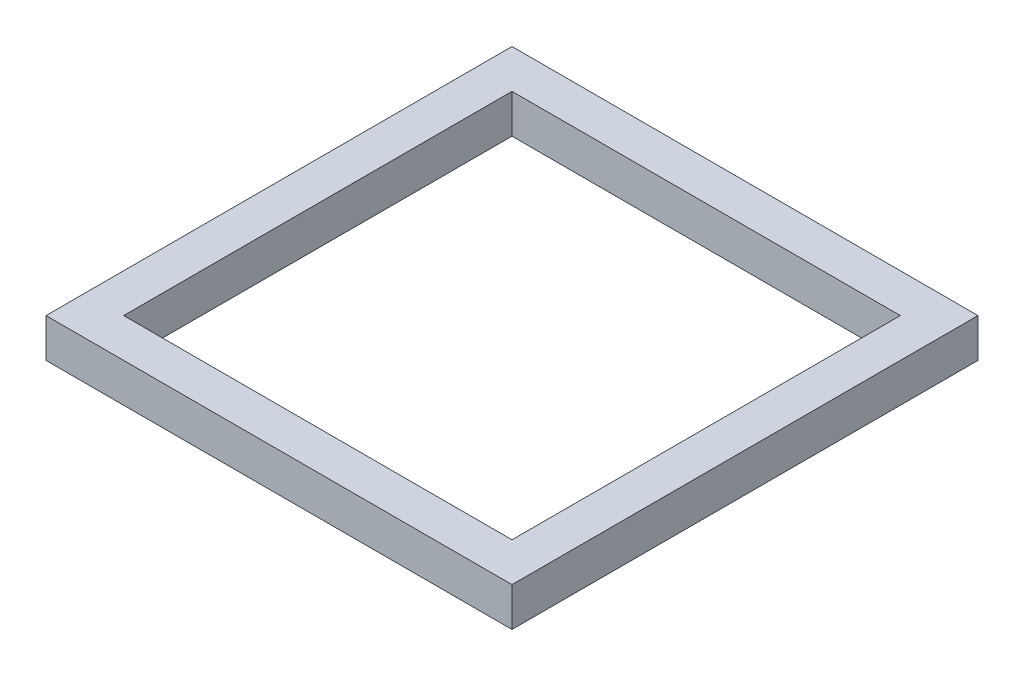
ISO-10303-21;
HEADER;
FILE_DESCRIPTION(('STEP AP214'),'2;1');
FILE_NAME('part.step','',(''),(''),'','','');
FILE_SCHEMA(('AUTOMOTIVE_DESIGN { 1 0 10303 214 1 1 1 1 }'));
ENDSEC;
DATA;
#1=APPLICATION_CONTEXT('core data for automotive mechanical design processes');
#2=APPLICATION_PROTOCOL_DEFINITION('international standard','automotive_design',2000,#1);
#3=PRODUCT_CONTEXT('',#1,'mechanical');
#4=PRODUCT('Part','Part','',(#3));
#5=PRODUCT_RELATED_PRODUCT_CATEGORY('part','',(#4));
#6=PRODUCT_DEFINITION_FORMATION('','',#4);
#7=PRODUCT_DEFINITION_CONTEXT('part definition',#1,'design');
#8=PRODUCT_DEFINITION('design','',#6,#7);
#9=PRODUCT_DEFINITION_SHAPE('','',#8);
#10=(LENGTH_UNIT() NAMED_UNIT(*) SI_UNIT(.MILLI.,.METRE.));
#11=(NAMED_UNIT(*) PLANE_ANGLE_UNIT() SI_UNIT($,.RADIAN.));
#12=(NAMED_UNIT(*) SI_UNIT($,.STERADIAN.) SOLID_ANGLE_UNIT());
#13=UNCERTAINTY_MEASURE_WITH_UNIT(LENGTH_MEASURE(1.E-05),#10,'distance_accuracy_value','');
#14=(GEOMETRIC_REPRESENTATION_CONTEXT(3) GLOBAL_UNCERTAINTY_ASSIGNED_CONTEXT((#13)) GLOBAL_UNIT_ASSIGNED_CONTEXT((#10,
#11,#12)) REPRESENTATION_CONTEXT('',''));
#15=CARTESIAN_POINT('',(0.,0.,0.));
#16=DIRECTION('',(0.,0.,1.));
#17=DIRECTION('',(1.,0.,0.));
#18=AXIS2_PLACEMENT_3D('',#15,#16,#17);
#19=CARTESIAN_POINT('',(0.,5.,0.));
#20=DIRECTION('',(0.,-1.,0.));
#21=DIRECTION('',(0.,0.,-1.));
#22=AXIS2_PLACEMENT_3D('',#19,#20,#21);
#23=PLANE('',#22);
#24=DIRECTION('',(0.,0.,-1.));
#25=VECTOR('',#24,1.);
#26=CARTESIAN_POINT('',(30.,5.,30.));
#27=LINE('',#26,#25);
#28=CARTESIAN_POINT('',(30.,5.,30.));
#29=VERTEX_POINT('',#28);
#30=CARTESIAN_POINT('',(30.,5.,-30.));
#31=VERTEX_POINT('',#30);
#32=EDGE_CURVE('E161',#29,#31,#27,.T.);
#33=ORIENTED_EDGE('',*,*,#32,.T.);
#34=DIRECTION('',(-1.,0.,0.));
#35=VECTOR('',#34,1.);
#36=CARTESIAN_POINT('',(-30.,5.,-30.));
#37=LINE('',#36,#35);
#38=CARTESIAN_POINT('',(-30.,5.,-30.));
#39=VERTEX_POINT('',#38);
#40=EDGE_CURVE('E170',#31,#39,#37,.T.);
#41=ORIENTED_EDGE('',*,*,#40,.T.);
#42=DIRECTION('',(0.,0.,1.));
#43=VECTOR('',#42,1.);
#44=CARTESIAN_POINT('',(-30.,5.,30.));
#45=LINE('',#44,#43);
#46=CARTESIAN_POINT('',(-30.,5.,30.));
#47=VERTEX_POINT('',#46);
#48=EDGE_CURVE('E171',#39,#47,#45,.T.);
#49=ORIENTED_EDGE('',*,*,#48,.T.);
#50=DIRECTION('',(1.,0.,0.));
#51=VECTOR('',#50,1.);
#52=CARTESIAN_POINT('',(-30.,5.,30.));
#53=LINE('',#52,#51);
#54=EDGE_CURVE('E176',#47,#29,#53,.T.);
#55=ORIENTED_EDGE('',*,*,#54,.T.);
#56=EDGE_LOOP('',(#33,#41,#49,#55));
#57=FACE_BOUND('',#56,.T.);
#58=DIRECTION('',(0.,0.,1.));
#59=VECTOR('',#58,1.);
#60=CARTESIAN_POINT('',(-25.,5.,25.));
#61=LINE('',#60,#59);
#62=CARTESIAN_POINT('',(-25.,5.,-25.));
#63=VERTEX_POINT('',#62);
#64=CARTESIAN_POINT('',(-25.,5.,25.));
#65=VERTEX_POINT('',#64);
#66=EDGE_CURVE('E113',#63,#65,#61,.T.);
#67=ORIENTED_EDGE('',*,*,#66,.F.);
#68=DIRECTION('',(-1.,0.,0.));
#69=VECTOR('',#68,1.);
#70=CARTESIAN_POINT('',(-25.,5.,-25.));
#71=LINE('',#70,#69);
#72=CARTESIAN_POINT('',(25.,5.,-25.));
#73=VERTEX_POINT('',#72);
#74=EDGE_CURVE('E143',#73,#63,#71,.T.);
#75=ORIENTED_EDGE('',*,*,#74,.F.);
#76=DIRECTION('',(0.,0.,-1.));
#77=VECTOR('',#76,1.);
#78=CARTESIAN_POINT('',(25.,5.,25.));
#79=LINE('',#78,#77);
#80=CARTESIAN_POINT('',(25.,5.,25.));
#81=VERTEX_POINT('',#80);
#82=EDGE_CURVE('E140',#81,#73,#79,.T.);
#83=ORIENTED_EDGE('',*,*,#82,.F.);
#84=DIRECTION('',(1.,0.,0.));
#85=VECTOR('',#84,1.);
#86=CARTESIAN_POINT('',(-25.,5.,25.));
#87=LINE('',#86,#85);
#88=EDGE_CURVE('E125',#65,#81,#87,.T.);
#89=ORIENTED_EDGE('',*,*,#88,.F.);
#90=EDGE_LOOP('',(#67,#75,#83,#89));
#91=FACE_BOUND('',#90,.T.);
#92=ADVANCED_FACE('F47',(#57,#91),#23,.F.);
#93=CARTESIAN_POINT('',(0.,0.,0.));
#94=DIRECTION('',(0.,-1.,0.));
#95=DIRECTION('',(0.,0.,-1.));
#96=AXIS2_PLACEMENT_3D('',#93,#94,#95);
#97=PLANE('',#96);
#98=DIRECTION('',(0.,0.,-1.));
#99=VECTOR('',#98,1.);
#100=CARTESIAN_POINT('',(30.,0.,30.));
#101=LINE('',#100,#99);
#102=CARTESIAN_POINT('',(30.,0.,30.));
#103=VERTEX_POINT('',#102);
#104=CARTESIAN_POINT('',(30.,0.,-30.));
#105=VERTEX_POINT('',#104);
#106=EDGE_CURVE('E133',#103,#105,#101,.T.);
#107=ORIENTED_EDGE('',*,*,#106,.F.);
#108=DIRECTION('',(1.,0.,0.));
#109=VECTOR('',#108,1.);
#110=CARTESIAN_POINT('',(-30.,0.,30.));
#111=LINE('',#110,#109);
#112=CARTESIAN_POINT('',(-30.,0.,30.));
#113=VERTEX_POINT('',#112);
#114=EDGE_CURVE('E169',#113,#103,#111,.T.);
#115=ORIENTED_EDGE('',*,*,#114,.F.);
#116=DIRECTION('',(0.,0.,1.));
#117=VECTOR('',#116,1.);
#118=CARTESIAN_POINT('',(-30.,0.,30.));
#119=LINE('',#118,#117);
#120=CARTESIAN_POINT('',(-30.,0.,-30.));
#121=VERTEX_POINT('',#120);
#122=EDGE_CURVE('E186',#121,#113,#119,.T.);
#123=ORIENTED_EDGE('',*,*,#122,.F.);
#124=DIRECTION('',(-1.,0.,0.));
#125=VECTOR('',#124,1.);
#126=CARTESIAN_POINT('',(-30.,0.,-30.));
#127=LINE('',#126,#125);
#128=EDGE_CURVE('E183',#105,#121,#127,.T.);
#129=ORIENTED_EDGE('',*,*,#128,.F.);
#130=EDGE_LOOP('',(#107,#115,#123,#129));
#131=FACE_BOUND('',#130,.T.);
#132=DIRECTION('',(-1.,0.,0.));
#133=VECTOR('',#132,1.);
#134=CARTESIAN_POINT('',(-25.,0.,-25.));
#135=LINE('',#134,#133);
#136=CARTESIAN_POINT('',(25.,0.,-25.));
#137=VERTEX_POINT('',#136);
#138=CARTESIAN_POINT('',(-25.,0.,-25.));
#139=VERTEX_POINT('',#138);
#140=EDGE_CURVE('E124',#137,#139,#135,.T.);
#141=ORIENTED_EDGE('',*,*,#140,.T.);
#142=DIRECTION('',(0.,0.,1.));
#143=VECTOR('',#142,1.);
#144=CARTESIAN_POINT('',(-25.,0.,25.));
#145=LINE('',#144,#143);
#146=CARTESIAN_POINT('',(-25.,0.,25.));
#147=VERTEX_POINT('',#146);
#148=EDGE_CURVE('E73',#139,#147,#145,.T.);
#149=ORIENTED_EDGE('',*,*,#148,.T.);
#150=DIRECTION('',(1.,0.,0.));
#151=VECTOR('',#150,1.);
#152=CARTESIAN_POINT('',(-25.,0.,25.));
#153=LINE('',#152,#151);
#154=CARTESIAN_POINT('',(25.,0.,25.));
#155=VERTEX_POINT('',#154);
#156=EDGE_CURVE('E131',#147,#155,#153,.T.);
#157=ORIENTED_EDGE('',*,*,#156,.T.);
#158=DIRECTION('',(0.,0.,-1.));
#159=VECTOR('',#158,1.);
#160=CARTESIAN_POINT('',(25.,0.,25.));
#161=LINE('',#160,#159);
#162=EDGE_CURVE('E155',#155,#137,#161,.T.);
#163=ORIENTED_EDGE('',*,*,#162,.T.);
#164=EDGE_LOOP('',(#141,#149,#157,#163));
#165=FACE_BOUND('',#164,.T.);
#166=ADVANCED_FACE('F209',(#131,#165),#97,.T.);
#167=CARTESIAN_POINT('',(30.,5.,30.));
#168=DIRECTION('',(-1.,0.,0.));
#169=DIRECTION('',(0.,0.,1.));
#170=AXIS2_PLACEMENT_3D('',#167,#168,#169);
#171=PLANE('',#170);
#172=ORIENTED_EDGE('',*,*,#106,.T.);
#173=DIRECTION('',(0.,-1.,0.));
#174=VECTOR('',#173,1.);
#175=CARTESIAN_POINT('',(30.,5.,-30.));
#176=LINE('',#175,#174);
#177=EDGE_CURVE('E11',#31,#105,#176,.T.);
#178=ORIENTED_EDGE('',*,*,#177,.F.);
#179=ORIENTED_EDGE('',*,*,#32,.F.);
#180=DIRECTION('',(0.,-1.,0.));
#181=VECTOR('',#180,1.);
#182=CARTESIAN_POINT('',(30.,5.,30.));
#183=LINE('',#182,#181);
#184=EDGE_CURVE('E177',#29,#103,#183,.T.);
#185=ORIENTED_EDGE('',*,*,#184,.T.);
#186=EDGE_LOOP('',(#172,#178,#179,#185));
#187=FACE_BOUND('',#186,.T.);
#188=ADVANCED_FACE('F51',(#187),#171,.F.);
#189=CARTESIAN_POINT('',(-30.,5.,-30.));
#190=DIRECTION('',(0.,0.,1.));
#191=DIRECTION('',(1.,0.,0.));
#192=AXIS2_PLACEMENT_3D('',#189,#190,#191);
#193=PLANE('',#192);
#194=ORIENTED_EDGE('',*,*,#128,.T.);
#195=DIRECTION('',(0.,-1.,0.));
#196=VECTOR('',#195,1.);
#197=CARTESIAN_POINT('',(-30.,5.,-30.));
#198=LINE('',#197,#196);
#199=EDGE_CURVE('E59',#39,#121,#198,.T.);
#200=ORIENTED_EDGE('',*,*,#199,.F.);
#201=ORIENTED_EDGE('',*,*,#40,.F.);
#202=ORIENTED_EDGE('',*,*,#177,.T.);
#203=EDGE_LOOP('',(#194,#200,#201,#202));
#204=FACE_BOUND('',#203,.T.);
#205=ADVANCED_FACE('F219',(#204),#193,.F.);
#206=CARTESIAN_POINT('',(-30.,5.,30.));
#207=DIRECTION('',(1.,0.,0.));
#208=DIRECTION('',(0.,0.,-1.));
#209=AXIS2_PLACEMENT_3D('',#206,#207,#208);
#210=PLANE('',#209);
#211=ORIENTED_EDGE('',*,*,#122,.T.);
#212=DIRECTION('',(0.,-1.,0.));
#213=VECTOR('',#212,1.);
#214=CARTESIAN_POINT('',(-30.,5.,30.));
#215=LINE('',#214,#213);
#216=EDGE_CURVE('E194',#47,#113,#215,.T.);
#217=ORIENTED_EDGE('',*,*,#216,.F.);
#218=ORIENTED_EDGE('',*,*,#48,.F.);
#219=ORIENTED_EDGE('',*,*,#199,.T.);
#220=EDGE_LOOP('',(#211,#217,#218,#219));
#221=FACE_BOUND('',#220,.T.);
#222=ADVANCED_FACE('F201',(#221),#210,.F.);
#223=CARTESIAN_POINT('',(-30.,5.,30.));
#224=DIRECTION('',(0.,0.,-1.));
#225=DIRECTION('',(-1.,0.,0.));
#226=AXIS2_PLACEMENT_3D('',#223,#224,#225);
#227=PLANE('',#226);
#228=ORIENTED_EDGE('',*,*,#114,.T.);
#229=ORIENTED_EDGE('',*,*,#184,.F.);
#230=ORIENTED_EDGE('',*,*,#54,.F.);
#231=ORIENTED_EDGE('',*,*,#216,.T.);
#232=EDGE_LOOP('',(#228,#229,#230,#231));
#233=FACE_BOUND('',#232,.T.);
#234=ADVANCED_FACE('F211',(#233),#227,.F.);
#235=CARTESIAN_POINT('',(-25.,5.,25.));
#236=DIRECTION('',(1.,0.,0.));
#237=DIRECTION('',(0.,0.,-1.));
#238=AXIS2_PLACEMENT_3D('',#235,#236,#237);
#239=PLANE('',#238);
#240=ORIENTED_EDGE('',*,*,#148,.F.);
#241=DIRECTION('',(0.,-1.,0.));
#242=VECTOR('',#241,1.);
#243=CARTESIAN_POINT('',(-25.,5.,-25.));
#244=LINE('',#243,#242);
#245=EDGE_CURVE('E119',#63,#139,#244,.T.);
#246=ORIENTED_EDGE('',*,*,#245,.F.);
#247=ORIENTED_EDGE('',*,*,#66,.T.);
#248=DIRECTION('',(0.,-1.,0.));
#249=VECTOR('',#248,1.);
#250=CARTESIAN_POINT('',(-25.,5.,25.));
#251=LINE('',#250,#249);
#252=EDGE_CURVE('E118',#65,#147,#251,.T.);
#253=ORIENTED_EDGE('',*,*,#252,.T.);
#254=EDGE_LOOP('',(#240,#246,#247,#253));
#255=FACE_BOUND('',#254,.T.);
#256=ADVANCED_FACE('F120',(#255),#239,.T.);
#257=CARTESIAN_POINT('',(-25.,5.,25.));
#258=DIRECTION('',(0.,0.,-1.));
#259=DIRECTION('',(-1.,0.,0.));
#260=AXIS2_PLACEMENT_3D('',#257,#258,#259);
#261=PLANE('',#260);
#262=ORIENTED_EDGE('',*,*,#156,.F.);
#263=ORIENTED_EDGE('',*,*,#252,.F.);
#264=ORIENTED_EDGE('',*,*,#88,.T.);
#265=DIRECTION('',(0.,-1.,0.));
#266=VECTOR('',#265,1.);
#267=CARTESIAN_POINT('',(25.,5.,25.));
#268=LINE('',#267,#266);
#269=EDGE_CURVE('E132',#81,#155,#268,.T.);
#270=ORIENTED_EDGE('',*,*,#269,.T.);
#271=EDGE_LOOP('',(#262,#263,#264,#270));
#272=FACE_BOUND('',#271,.T.);
#273=ADVANCED_FACE('F126',(#272),#261,.T.);
#274=CARTESIAN_POINT('',(25.,5.,25.));
#275=DIRECTION('',(-1.,0.,0.));
#276=DIRECTION('',(0.,0.,1.));
#277=AXIS2_PLACEMENT_3D('',#274,#275,#276);
#278=PLANE('',#277);
#279=ORIENTED_EDGE('',*,*,#162,.F.);
#280=ORIENTED_EDGE('',*,*,#269,.F.);
#281=ORIENTED_EDGE('',*,*,#82,.T.);
#282=DIRECTION('',(0.,-1.,0.));
#283=VECTOR('',#282,1.);
#284=CARTESIAN_POINT('',(25.,5.,-25.));
#285=LINE('',#284,#283);
#286=EDGE_CURVE('E61',#73,#137,#285,.T.);
#287=ORIENTED_EDGE('',*,*,#286,.T.);
#288=EDGE_LOOP('',(#279,#280,#281,#287));
#289=FACE_BOUND('',#288,.T.);
#290=ADVANCED_FACE('F239',(#289),#278,.T.);
#291=CARTESIAN_POINT('',(-25.,5.,-25.));
#292=DIRECTION('',(0.,0.,1.));
#293=DIRECTION('',(1.,0.,0.));
#294=AXIS2_PLACEMENT_3D('',#291,#292,#293);
#295=PLANE('',#294);
#296=ORIENTED_EDGE('',*,*,#140,.F.);
#297=ORIENTED_EDGE('',*,*,#286,.F.);
#298=ORIENTED_EDGE('',*,*,#74,.T.);
#299=ORIENTED_EDGE('',*,*,#245,.T.);
#300=EDGE_LOOP('',(#296,#297,#298,#299));
#301=FACE_BOUND('',#300,.T.);
#302=ADVANCED_FACE('F242',(#301),#295,.T.);
#303=CLOSED_SHELL('',(#92,#166,#188,#205,#222,#234,#256,#273,#290,#302));
#304=MANIFOLD_SOLID_BREP('B2',#303);
#305=ADVANCED_BREP_SHAPE_REPRESENTATION('',(#18,#304),#14);
#306=SHAPE_DEFINITION_REPRESENTATION(#9,#305);
ENDSEC;
END-ISO-10303-21;
